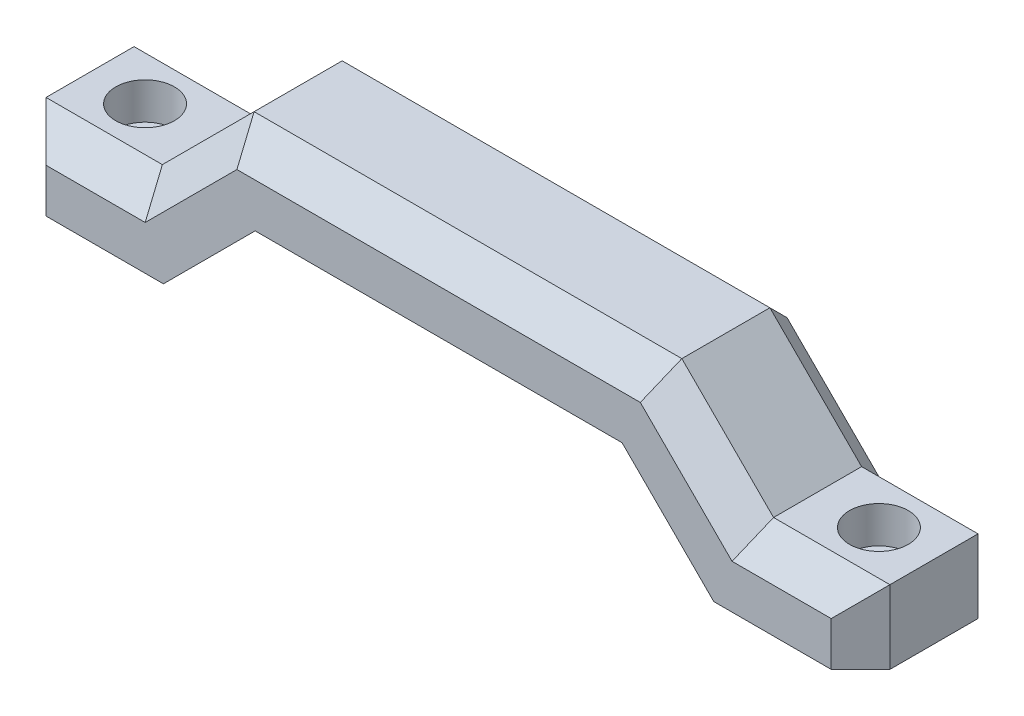
ISO-10303-21;
HEADER;
FILE_DESCRIPTION(('STEP AP214'),'2;1');
FILE_NAME('part.step','',(''),(''),'','','');
FILE_SCHEMA(('AUTOMOTIVE_DESIGN { 1 0 10303 214 1 1 1 1 }'));
ENDSEC;
DATA;
#1=APPLICATION_CONTEXT('core data for automotive mechanical design processes');
#2=APPLICATION_PROTOCOL_DEFINITION('international standard','automotive_design',2000,#1);
#3=PRODUCT_CONTEXT('',#1,'mechanical');
#4=PRODUCT('Part','Part','',(#3));
#5=PRODUCT_RELATED_PRODUCT_CATEGORY('part','',(#4));
#6=PRODUCT_DEFINITION_FORMATION('','',#4);
#7=PRODUCT_DEFINITION_CONTEXT('part definition',#1,'design');
#8=PRODUCT_DEFINITION('design','',#6,#7);
#9=PRODUCT_DEFINITION_SHAPE('','',#8);
#10=(LENGTH_UNIT() NAMED_UNIT(*) SI_UNIT(.MILLI.,.METRE.));
#11=(NAMED_UNIT(*) PLANE_ANGLE_UNIT() SI_UNIT($,.RADIAN.));
#12=(NAMED_UNIT(*) SI_UNIT($,.STERADIAN.) SOLID_ANGLE_UNIT());
#13=UNCERTAINTY_MEASURE_WITH_UNIT(LENGTH_MEASURE(1.E-05),#10,'distance_accuracy_value','');
#14=(GEOMETRIC_REPRESENTATION_CONTEXT(3) GLOBAL_UNCERTAINTY_ASSIGNED_CONTEXT((#13)) GLOBAL_UNIT_ASSIGNED_CONTEXT((#10,
#11,#12)) REPRESENTATION_CONTEXT('',''));
#15=CARTESIAN_POINT('',(0.,0.,0.));
#16=DIRECTION('',(0.,0.,1.));
#17=DIRECTION('',(1.,0.,0.));
#18=AXIS2_PLACEMENT_3D('',#15,#16,#17);
#19=CARTESIAN_POINT('',(-50.,-12.5,10.));
#20=DIRECTION('',(0.,1.,0.));
#21=DIRECTION('',(-1.,0.,0.));
#22=AXIS2_PLACEMENT_3D('',#19,#20,#21);
#23=CYLINDRICAL_SURFACE('',#22,1.75);
#24=CARTESIAN_POINT('',(-50.,-12.5,10.));
#25=DIRECTION('',(0.,1.,0.));
#26=DIRECTION('',(-1.,0.,0.));
#27=AXIS2_PLACEMENT_3D('',#24,#25,#26);
#28=CIRCLE('',#27,1.75);
#29=CARTESIAN_POINT('',(-51.75,-12.5,10.));
#30=VERTEX_POINT('',#29);
#31=EDGE_CURVE('E292',#30,#30,#28,.T.);
#32=CARTESIAN_POINT('',(-50.,-7.49999999999997,10.));
#33=DIRECTION('',(0.,1.,0.));
#34=DIRECTION('',(-1.,0.,0.));
#35=AXIS2_PLACEMENT_3D('',#32,#33,#34);
#36=CIRCLE('',#35,1.75);
#37=CARTESIAN_POINT('',(-51.75,-7.49999999999997,10.));
#38=VERTEX_POINT('',#37);
#39=EDGE_CURVE('E44',#38,#38,#36,.F.);
#40=CARTESIAN_POINT('',(-51.75,-12.5,10.));
#41=CARTESIAN_POINT('',(-51.75,-12.4479166666667,10.));
#42=CARTESIAN_POINT('',(-51.75,-12.3958333333334,10.));
#43=CARTESIAN_POINT('',(-51.75,-12.2916666666667,10.));
#44=CARTESIAN_POINT('',(-51.75,-12.2395833333334,10.));
#45=CARTESIAN_POINT('',(-51.75,-12.1354166666667,10.));
#46=CARTESIAN_POINT('',(-51.75,-12.0833333333334,10.));
#47=CARTESIAN_POINT('',(-51.75,-11.9791666666667,10.));
#48=CARTESIAN_POINT('',(-51.75,-11.9270833333334,10.));
#49=CARTESIAN_POINT('',(-51.75,-11.8229166666667,10.));
#50=CARTESIAN_POINT('',(-51.75,-11.7708333333334,10.));
#51=CARTESIAN_POINT('',(-51.75,-11.6666666666667,10.));
#52=CARTESIAN_POINT('',(-51.75,-11.6145833333334,10.));
#53=CARTESIAN_POINT('',(-51.75,-11.5104166666667,10.));
#54=CARTESIAN_POINT('',(-51.75,-11.4583333333334,10.));
#55=CARTESIAN_POINT('',(-51.75,-11.3541666666667,10.));
#56=CARTESIAN_POINT('',(-51.75,-11.3020833333334,10.));
#57=CARTESIAN_POINT('',(-51.75,-11.1979166666667,10.));
#58=CARTESIAN_POINT('',(-51.75,-11.1458333333333,10.));
#59=CARTESIAN_POINT('',(-51.75,-11.0416666666667,10.));
#60=CARTESIAN_POINT('',(-51.75,-10.9895833333333,10.));
#61=CARTESIAN_POINT('',(-51.75,-10.8854166666667,10.));
#62=CARTESIAN_POINT('',(-51.75,-10.8333333333333,10.));
#63=CARTESIAN_POINT('',(-51.75,-10.7291666666667,10.));
#64=CARTESIAN_POINT('',(-51.75,-10.6770833333333,10.));
#65=CARTESIAN_POINT('',(-51.75,-10.5729166666667,10.));
#66=CARTESIAN_POINT('',(-51.75,-10.5208333333333,10.));
#67=CARTESIAN_POINT('',(-51.75,-10.4166666666667,10.));
#68=CARTESIAN_POINT('',(-51.75,-10.3645833333333,10.));
#69=CARTESIAN_POINT('',(-51.75,-10.2604166666667,10.));
#70=CARTESIAN_POINT('',(-51.75,-10.2083333333333,10.));
#71=CARTESIAN_POINT('',(-51.75,-10.1041666666667,10.));
#72=CARTESIAN_POINT('',(-51.75,-10.0520833333333,10.));
#73=CARTESIAN_POINT('',(-51.75,-9.94791666666666,10.));
#74=CARTESIAN_POINT('',(-51.75,-9.89583333333333,10.));
#75=CARTESIAN_POINT('',(-51.75,-9.79166666666666,10.));
#76=CARTESIAN_POINT('',(-51.75,-9.73958333333333,10.));
#77=CARTESIAN_POINT('',(-51.75,-9.63541666666666,10.));
#78=CARTESIAN_POINT('',(-51.75,-9.58333333333333,10.));
#79=CARTESIAN_POINT('',(-51.75,-9.47916666666666,10.));
#80=CARTESIAN_POINT('',(-51.75,-9.42708333333333,10.));
#81=CARTESIAN_POINT('',(-51.75,-9.32291666666666,10.));
#82=CARTESIAN_POINT('',(-51.75,-9.27083333333332,10.));
#83=CARTESIAN_POINT('',(-51.75,-9.16666666666666,10.));
#84=CARTESIAN_POINT('',(-51.75,-9.11458333333332,10.));
#85=CARTESIAN_POINT('',(-51.75,-9.01041666666665,10.));
#86=CARTESIAN_POINT('',(-51.75,-8.95833333333332,10.));
#87=CARTESIAN_POINT('',(-51.75,-8.85416666666665,10.));
#88=CARTESIAN_POINT('',(-51.75,-8.80208333333332,10.));
#89=CARTESIAN_POINT('',(-51.75,-8.69791666666665,10.));
#90=CARTESIAN_POINT('',(-51.75,-8.64583333333331,10.));
#91=CARTESIAN_POINT('',(-51.75,-8.54166666666665,10.));
#92=CARTESIAN_POINT('',(-51.75,-8.48958333333331,10.));
#93=CARTESIAN_POINT('',(-51.75,-8.38541666666664,10.));
#94=CARTESIAN_POINT('',(-51.75,-8.33333333333331,10.));
#95=CARTESIAN_POINT('',(-51.75,-8.22916666666664,10.));
#96=CARTESIAN_POINT('',(-51.75,-8.17708333333331,10.));
#97=CARTESIAN_POINT('',(-51.75,-8.07291666666664,10.));
#98=CARTESIAN_POINT('',(-51.75,-8.02083333333331,10.));
#99=CARTESIAN_POINT('',(-51.75,-7.91666666666664,10.));
#100=CARTESIAN_POINT('',(-51.75,-7.8645833333333,10.));
#101=CARTESIAN_POINT('',(-51.75,-7.76041666666664,10.));
#102=CARTESIAN_POINT('',(-51.75,-7.7083333333333,10.));
#103=CARTESIAN_POINT('',(-51.75,-7.60416666666663,10.));
#104=CARTESIAN_POINT('',(-51.75,-7.5520833333333,10.));
#105=CARTESIAN_POINT('',(-51.75,-7.49999999999997,10.));
#106=B_SPLINE_CURVE_WITH_KNOTS('',3,(#40,#41,#42,#43,#44,#45,#46,#47,#48,#49,#50,#51,#52,#53,
#54,#55,#56,#57,#58,#59,#60,#61,#62,#63,#64,#65,#66,#67,#68,#69,#70,#71,#72,#73,#74,#75,#76,#77,
#78,#79,#80,#81,#82,#83,#84,#85,#86,#87,#88,#89,#90,#91,#92,#93,#94,#95,#96,#97,#98,#99,#100,
#101,#102,#103,#104,#105),.UNSPECIFIED.,.F.,.F.,(4,2,2,2,2,2,2,2,2,2,2,2,2,2,2,2,2,2,2,2,2,2,2,
2,2,2,2,2,2,2,2,2,4),(0.,0.156250000000002,0.312500000000004,0.468750000000006,
0.625000000000008,0.781250000000009,0.937500000000011,1.09375000000001,1.25000000000002,
1.40625000000002,1.56250000000002,1.71875000000002,1.87500000000002,2.03125000000003,
2.18750000000003,2.34375000000003,2.50000000000003,2.65625000000004,2.81250000000004,
2.96875000000004,3.12500000000004,3.28125000000004,3.43750000000004,3.59375000000005,
3.75000000000005,3.90625000000005,4.06250000000005,4.21875000000006,4.37500000000006,
4.53125000000006,4.68750000000006,4.84375000000006,5.00000000000007),.UNSPECIFIED.);
#107=EDGE_CURVE('BSEAM39',#30,#38,#106,.T.);
#108=ORIENTED_EDGE('',*,*,#31,.F.);
#109=ORIENTED_EDGE('',*,*,#39,.F.);
#110=ORIENTED_EDGE('',*,*,#107,.T.);
#111=ORIENTED_EDGE('',*,*,#107,.F.);
#112=EDGE_LOOP('',(#108,#110,#109,#111));
#113=FACE_BOUND('',#112,.T.);
#114=ADVANCED_FACE('F39',(#113),#23,.F.);
#115=CARTESIAN_POINT('',(50.,-12.5,10.));
#116=DIRECTION('',(0.,1.,0.));
#117=DIRECTION('',(-1.,0.,0.));
#118=AXIS2_PLACEMENT_3D('',#115,#116,#117);
#119=CYLINDRICAL_SURFACE('',#118,1.75);
#120=CARTESIAN_POINT('',(50.,-12.5,10.));
#121=DIRECTION('',(0.,1.,0.));
#122=DIRECTION('',(-1.,0.,0.));
#123=AXIS2_PLACEMENT_3D('',#120,#121,#122);
#124=CIRCLE('',#123,1.75);
#125=CARTESIAN_POINT('',(48.25,-12.5,10.));
#126=VERTEX_POINT('',#125);
#127=EDGE_CURVE('E311',#126,#126,#124,.T.);
#128=CARTESIAN_POINT('',(50.,-7.49999999999994,10.));
#129=DIRECTION('',(0.,1.,0.));
#130=DIRECTION('',(-1.,0.,0.));
#131=AXIS2_PLACEMENT_3D('',#128,#129,#130);
#132=CIRCLE('',#131,1.75);
#133=CARTESIAN_POINT('',(48.25,-7.49999999999994,10.));
#134=VERTEX_POINT('',#133);
#135=EDGE_CURVE('E305',#134,#134,#132,.F.);
#136=CARTESIAN_POINT('',(48.25,-12.5,10.));
#137=CARTESIAN_POINT('',(48.25,-12.4479166666666,10.));
#138=CARTESIAN_POINT('',(48.25,-12.3958333333333,10.));
#139=CARTESIAN_POINT('',(48.25,-12.2916666666666,10.));
#140=CARTESIAN_POINT('',(48.25,-12.2395833333333,10.));
#141=CARTESIAN_POINT('',(48.25,-12.1354166666666,10.));
#142=CARTESIAN_POINT('',(48.25,-12.0833333333333,10.));
#143=CARTESIAN_POINT('',(48.25,-11.9791666666666,10.));
#144=CARTESIAN_POINT('',(48.25,-11.9270833333333,10.));
#145=CARTESIAN_POINT('',(48.25,-11.8229166666666,10.));
#146=CARTESIAN_POINT('',(48.25,-11.7708333333333,10.));
#147=CARTESIAN_POINT('',(48.25,-11.6666666666666,10.));
#148=CARTESIAN_POINT('',(48.25,-11.6145833333333,10.));
#149=CARTESIAN_POINT('',(48.25,-11.5104166666666,10.));
#150=CARTESIAN_POINT('',(48.25,-11.4583333333333,10.));
#151=CARTESIAN_POINT('',(48.25,-11.3541666666666,10.));
#152=CARTESIAN_POINT('',(48.25,-11.3020833333333,10.));
#153=CARTESIAN_POINT('',(48.25,-11.1979166666666,10.));
#154=CARTESIAN_POINT('',(48.25,-11.1458333333333,10.));
#155=CARTESIAN_POINT('',(48.25,-11.0416666666666,10.));
#156=CARTESIAN_POINT('',(48.25,-10.9895833333333,10.));
#157=CARTESIAN_POINT('',(48.25,-10.8854166666666,10.));
#158=CARTESIAN_POINT('',(48.25,-10.8333333333333,10.));
#159=CARTESIAN_POINT('',(48.25,-10.7291666666666,10.));
#160=CARTESIAN_POINT('',(48.25,-10.6770833333333,10.));
#161=CARTESIAN_POINT('',(48.25,-10.5729166666666,10.));
#162=CARTESIAN_POINT('',(48.25,-10.5208333333333,10.));
#163=CARTESIAN_POINT('',(48.25,-10.4166666666666,10.));
#164=CARTESIAN_POINT('',(48.25,-10.3645833333333,10.));
#165=CARTESIAN_POINT('',(48.25,-10.2604166666666,10.));
#166=CARTESIAN_POINT('',(48.25,-10.2083333333333,10.));
#167=CARTESIAN_POINT('',(48.25,-10.1041666666666,10.));
#168=CARTESIAN_POINT('',(48.25,-10.0520833333333,10.));
#169=CARTESIAN_POINT('',(48.25,-9.94791666666663,10.));
#170=CARTESIAN_POINT('',(48.25,-9.89583333333329,10.));
#171=CARTESIAN_POINT('',(48.25,-9.79166666666663,10.));
#172=CARTESIAN_POINT('',(48.25,-9.73958333333329,10.));
#173=CARTESIAN_POINT('',(48.25,-9.63541666666662,10.));
#174=CARTESIAN_POINT('',(48.25,-9.58333333333329,10.));
#175=CARTESIAN_POINT('',(48.25,-9.47916666666662,10.));
#176=CARTESIAN_POINT('',(48.25,-9.42708333333329,10.));
#177=CARTESIAN_POINT('',(48.25,-9.32291666666662,10.));
#178=CARTESIAN_POINT('',(48.25,-9.27083333333329,10.));
#179=CARTESIAN_POINT('',(48.25,-9.16666666666662,10.));
#180=CARTESIAN_POINT('',(48.25,-9.11458333333329,10.));
#181=CARTESIAN_POINT('',(48.25,-9.01041666666662,10.));
#182=CARTESIAN_POINT('',(48.25,-8.95833333333329,10.));
#183=CARTESIAN_POINT('',(48.25,-8.85416666666662,10.));
#184=CARTESIAN_POINT('',(48.25,-8.80208333333328,10.));
#185=CARTESIAN_POINT('',(48.25,-8.69791666666662,10.));
#186=CARTESIAN_POINT('',(48.25,-8.64583333333328,10.));
#187=CARTESIAN_POINT('',(48.25,-8.54166666666662,10.));
#188=CARTESIAN_POINT('',(48.25,-8.48958333333328,10.));
#189=CARTESIAN_POINT('',(48.25,-8.38541666666662,10.));
#190=CARTESIAN_POINT('',(48.25,-8.33333333333328,10.));
#191=CARTESIAN_POINT('',(48.25,-8.22916666666662,10.));
#192=CARTESIAN_POINT('',(48.25,-8.17708333333328,10.));
#193=CARTESIAN_POINT('',(48.25,-8.07291666666661,10.));
#194=CARTESIAN_POINT('',(48.25,-8.02083333333328,10.));
#195=CARTESIAN_POINT('',(48.25,-7.91666666666661,10.));
#196=CARTESIAN_POINT('',(48.25,-7.86458333333328,10.));
#197=CARTESIAN_POINT('',(48.25,-7.76041666666661,10.));
#198=CARTESIAN_POINT('',(48.25,-7.70833333333328,10.));
#199=CARTESIAN_POINT('',(48.25,-7.60416666666661,10.));
#200=CARTESIAN_POINT('',(48.25,-7.55208333333328,10.));
#201=CARTESIAN_POINT('',(48.25,-7.49999999999994,10.));
#202=B_SPLINE_CURVE_WITH_KNOTS('',3,(#136,#137,#138,#139,#140,#141,#142,#143,#144,#145,#146,
#147,#148,#149,#150,#151,#152,#153,#154,#155,#156,#157,#158,#159,#160,#161,#162,#163,#164,#165,
#166,#167,#168,#169,#170,#171,#172,#173,#174,#175,#176,#177,#178,#179,#180,#181,#182,#183,#184,
#185,#186,#187,#188,#189,#190,#191,#192,#193,#194,#195,#196,#197,#198,#199,#200,#201),
.UNSPECIFIED.,.F.,.F.,(4,2,2,2,2,2,2,2,2,2,2,2,2,2,2,2,2,2,2,2,2,2,2,2,2,2,2,2,2,2,2,2,4),(0.,
0.15625,0.312500000000002,0.468750000000002,0.625000000000004,0.781250000000004,
0.937500000000006,1.09375000000001,1.25000000000001,1.40625000000001,1.56250000000001,
1.71875000000001,1.87500000000001,2.03125000000001,2.18750000000001,2.34375000000002,
2.50000000000002,2.65625000000002,2.81250000000002,2.96875000000002,3.12500000000002,
3.28125000000002,3.43750000000002,3.59375000000002,3.75000000000002,3.90625000000002,
4.06250000000003,4.21875000000003,4.37500000000003,4.53125000000003,4.68750000000003,
4.84375000000003,5.00000000000003),.UNSPECIFIED.);
#203=EDGE_CURVE('BSEAM422',#126,#134,#202,.T.);
#204=ORIENTED_EDGE('',*,*,#127,.F.);
#205=ORIENTED_EDGE('',*,*,#135,.F.);
#206=ORIENTED_EDGE('',*,*,#203,.T.);
#207=ORIENTED_EDGE('',*,*,#203,.F.);
#208=EDGE_LOOP('',(#204,#206,#205,#207));
#209=FACE_BOUND('',#208,.T.);
#210=ADVANCED_FACE('F422',(#209),#119,.F.);
#211=CARTESIAN_POINT('',(-25.,0.,20.));
#212=DIRECTION('',(-0.707106781186544,0.707106781186551,0.));
#213=DIRECTION('',(-0.707106781186551,-0.707106781186544,0.));
#214=AXIS2_PLACEMENT_3D('',#211,#212,#213);
#215=PLANE('',#214);
#216=DIRECTION('',(0.707106781186551,0.707106781186544,0.));
#217=VECTOR('',#216,1.);
#218=CARTESIAN_POINT('',(-25.,0.,0.));
#219=LINE('',#218,#217);
#220=CARTESIAN_POINT('',(-37.5000000000001,-12.5,0.));
#221=VERTEX_POINT('',#220);
#222=CARTESIAN_POINT('',(-25.,0.,0.));
#223=VERTEX_POINT('',#222);
#224=EDGE_CURVE('E204',#221,#223,#219,.T.);
#225=ORIENTED_EDGE('',*,*,#224,.T.);
#226=DIRECTION('',(0.,0.,-1.));
#227=VECTOR('',#226,1.);
#228=CARTESIAN_POINT('',(-25.,0.,20.));
#229=LINE('',#228,#227);
#230=CARTESIAN_POINT('',(-25.,0.,20.));
#231=VERTEX_POINT('',#230);
#232=EDGE_CURVE('E184',#231,#223,#229,.T.);
#233=ORIENTED_EDGE('',*,*,#232,.F.);
#234=DIRECTION('',(0.707106781186551,0.707106781186544,0.));
#235=VECTOR('',#234,1.);
#236=CARTESIAN_POINT('',(-25.,0.,20.));
#237=LINE('',#236,#235);
#238=CARTESIAN_POINT('',(-37.5000000000001,-12.5,20.));
#239=VERTEX_POINT('',#238);
#240=EDGE_CURVE('E190',#239,#231,#237,.T.);
#241=ORIENTED_EDGE('',*,*,#240,.F.);
#242=DIRECTION('',(0.,0.,-1.));
#243=VECTOR('',#242,1.);
#244=CARTESIAN_POINT('',(-37.5000000000001,-12.5,20.));
#245=LINE('',#244,#243);
#246=EDGE_CURVE('E334',#239,#221,#245,.T.);
#247=ORIENTED_EDGE('',*,*,#246,.T.);
#248=EDGE_LOOP('',(#225,#233,#241,#247));
#249=FACE_BOUND('',#248,.T.);
#250=ADVANCED_FACE('F202',(#249),#215,.F.);
#251=CARTESIAN_POINT('',(-25.,0.,20.));
#252=DIRECTION('',(0.,1.,0.));
#253=DIRECTION('',(0.,0.,1.));
#254=AXIS2_PLACEMENT_3D('',#251,#252,#253);
#255=PLANE('',#254);
#256=DIRECTION('',(1.,0.,0.));
#257=VECTOR('',#256,1.);
#258=CARTESIAN_POINT('',(-25.,0.,0.));
#259=LINE('',#258,#257);
#260=CARTESIAN_POINT('',(25.,0.,0.));
#261=VERTEX_POINT('',#260);
#262=EDGE_CURVE('E336',#223,#261,#259,.T.);
#263=ORIENTED_EDGE('',*,*,#262,.T.);
#264=DIRECTION('',(0.,0.,-1.));
#265=VECTOR('',#264,1.);
#266=CARTESIAN_POINT('',(25.,0.,20.));
#267=LINE('',#266,#265);
#268=CARTESIAN_POINT('',(25.,0.,20.));
#269=VERTEX_POINT('',#268);
#270=EDGE_CURVE('E187',#269,#261,#267,.T.);
#271=ORIENTED_EDGE('',*,*,#270,.F.);
#272=DIRECTION('',(1.,0.,0.));
#273=VECTOR('',#272,1.);
#274=CARTESIAN_POINT('',(-25.,0.,20.));
#275=LINE('',#274,#273);
#276=EDGE_CURVE('E180',#231,#269,#275,.T.);
#277=ORIENTED_EDGE('',*,*,#276,.F.);
#278=ORIENTED_EDGE('',*,*,#232,.T.);
#279=EDGE_LOOP('',(#263,#271,#277,#278));
#280=FACE_BOUND('',#279,.T.);
#281=ADVANCED_FACE('F182',(#280),#255,.F.);
#282=CARTESIAN_POINT('',(25.,0.,20.));
#283=DIRECTION('',(0.707106781186549,0.707106781186547,0.));
#284=DIRECTION('',(-0.707106781186546,0.707106781186549,0.));
#285=AXIS2_PLACEMENT_3D('',#282,#283,#284);
#286=PLANE('',#285);
#287=DIRECTION('',(0.707106781186547,-0.707106781186549,0.));
#288=VECTOR('',#287,1.);
#289=CARTESIAN_POINT('',(25.,0.,0.));
#290=LINE('',#289,#288);
#291=CARTESIAN_POINT('',(37.4999999999999,-12.5,0.));
#292=VERTEX_POINT('',#291);
#293=EDGE_CURVE('E338',#261,#292,#290,.T.);
#294=ORIENTED_EDGE('',*,*,#293,.T.);
#295=DIRECTION('',(0.,0.,-1.));
#296=VECTOR('',#295,1.);
#297=CARTESIAN_POINT('',(37.4999999999999,-12.5,20.));
#298=LINE('',#297,#296);
#299=CARTESIAN_POINT('',(37.4999999999999,-12.5,20.));
#300=VERTEX_POINT('',#299);
#301=EDGE_CURVE('E209',#300,#292,#298,.T.);
#302=ORIENTED_EDGE('',*,*,#301,.F.);
#303=DIRECTION('',(0.707106781186547,-0.707106781186549,0.));
#304=VECTOR('',#303,1.);
#305=CARTESIAN_POINT('',(25.,0.,20.));
#306=LINE('',#305,#304);
#307=EDGE_CURVE('E189',#269,#300,#306,.T.);
#308=ORIENTED_EDGE('',*,*,#307,.F.);
#309=ORIENTED_EDGE('',*,*,#270,.T.);
#310=EDGE_LOOP('',(#294,#302,#308,#309));
#311=FACE_BOUND('',#310,.T.);
#312=ADVANCED_FACE('F411',(#311),#286,.F.);
#313=CARTESIAN_POINT('',(37.4999999999999,-12.5,20.));
#314=DIRECTION('',(0.,1.,0.));
#315=DIRECTION('',(-1.,0.,0.));
#316=AXIS2_PLACEMENT_3D('',#313,#314,#315);
#317=PLANE('',#316);
#318=ORIENTED_EDGE('',*,*,#127,.T.);
#319=EDGE_LOOP('',(#318));
#320=FACE_BOUND('',#319,.T.);
#321=DIRECTION('',(1.,0.,0.));
#322=VECTOR('',#321,1.);
#323=CARTESIAN_POINT('',(37.4999999999999,-12.5,0.));
#324=LINE('',#323,#322);
#325=CARTESIAN_POINT('',(53.4999999999999,-12.4999999999999,0.));
#326=VERTEX_POINT('',#325);
#327=EDGE_CURVE('E340',#292,#326,#324,.T.);
#328=ORIENTED_EDGE('',*,*,#327,.T.);
#329=DIRECTION('',(-0.707106781186549,0.,-0.707106781186546));
#330=VECTOR('',#329,1.);
#331=CARTESIAN_POINT('',(57.4999999999999,-12.4999999999999,4.));
#332=LINE('',#331,#330);
#333=CARTESIAN_POINT('',(57.4999999999999,-12.4999999999999,4.));
#334=VERTEX_POINT('',#333);
#335=EDGE_CURVE('E239',#326,#334,#332,.F.);
#336=ORIENTED_EDGE('',*,*,#335,.T.);
#337=DIRECTION('',(0.,0.,-1.));
#338=VECTOR('',#337,1.);
#339=CARTESIAN_POINT('',(57.4999999999999,-12.4999999999999,20.));
#340=LINE('',#339,#338);
#341=CARTESIAN_POINT('',(57.4999999999999,-12.4999999999999,16.));
#342=VERTEX_POINT('',#341);
#343=EDGE_CURVE('E366',#342,#334,#340,.T.);
#344=ORIENTED_EDGE('',*,*,#343,.F.);
#345=DIRECTION('',(-0.707106781186546,0.,0.707106781186549));
#346=VECTOR('',#345,1.);
#347=CARTESIAN_POINT('',(53.4999999999999,-12.4999999999999,20.));
#348=LINE('',#347,#346);
#349=CARTESIAN_POINT('',(53.4999999999999,-12.4999999999999,20.));
#350=VERTEX_POINT('',#349);
#351=EDGE_CURVE('E237',#342,#350,#348,.T.);
#352=ORIENTED_EDGE('',*,*,#351,.T.);
#353=DIRECTION('',(1.,0.,0.));
#354=VECTOR('',#353,1.);
#355=CARTESIAN_POINT('',(37.4999999999999,-12.5,20.));
#356=LINE('',#355,#354);
#357=EDGE_CURVE('E331',#300,#350,#356,.T.);
#358=ORIENTED_EDGE('',*,*,#357,.F.);
#359=ORIENTED_EDGE('',*,*,#301,.T.);
#360=EDGE_LOOP('',(#328,#336,#344,#352,#358,#359));
#361=FACE_BOUND('',#360,.T.);
#362=ADVANCED_FACE('F373',(#320,#361),#317,.F.);
#363=CARTESIAN_POINT('',(57.4999999999999,-2.49999999999995,20.));
#364=DIRECTION('',(-1.,0.,0.));
#365=DIRECTION('',(0.,0.,1.));
#366=AXIS2_PLACEMENT_3D('',#363,#364,#365);
#367=PLANE('',#366);
#368=ORIENTED_EDGE('',*,*,#343,.T.);
#369=DIRECTION('',(0.,1.,0.));
#370=VECTOR('',#369,1.);
#371=CARTESIAN_POINT('',(57.4999999999999,-2.49999999999995,4.));
#372=LINE('',#371,#370);
#373=CARTESIAN_POINT('',(57.4999999999999,-2.49999999999995,4.));
#374=VERTEX_POINT('',#373);
#375=EDGE_CURVE('E235',#334,#374,#372,.T.);
#376=ORIENTED_EDGE('',*,*,#375,.T.);
#377=DIRECTION('',(0.,0.,-1.));
#378=VECTOR('',#377,1.);
#379=CARTESIAN_POINT('',(57.4999999999999,-2.49999999999995,20.));
#380=LINE('',#379,#378);
#381=CARTESIAN_POINT('',(57.4999999999999,-2.49999999999995,16.));
#382=VERTEX_POINT('',#381);
#383=EDGE_CURVE('E363',#382,#374,#380,.T.);
#384=ORIENTED_EDGE('',*,*,#383,.F.);
#385=DIRECTION('',(0.,-1.,0.));
#386=VECTOR('',#385,1.);
#387=CARTESIAN_POINT('',(57.4999999999999,-12.4999999999999,16.));
#388=LINE('',#387,#386);
#389=EDGE_CURVE('E233',#382,#342,#388,.T.);
#390=ORIENTED_EDGE('',*,*,#389,.T.);
#391=EDGE_LOOP('',(#368,#376,#384,#390));
#392=FACE_BOUND('',#391,.T.);
#393=ADVANCED_FACE('F407',(#392),#367,.F.);
#394=CARTESIAN_POINT('',(41.6421356237309,-2.49999999999995,20.));
#395=DIRECTION('',(0.,-1.,0.));
#396=DIRECTION('',(1.,0.,0.));
#397=AXIS2_PLACEMENT_3D('',#394,#395,#396);
#398=PLANE('',#397);
#399=CARTESIAN_POINT('',(50.,-2.49999999999994,10.));
#400=DIRECTION('',(0.,1.,0.));
#401=DIRECTION('',(-1.,0.,0.));
#402=AXIS2_PLACEMENT_3D('',#399,#400,#401);
#403=CIRCLE('',#402,4.00000000000001);
#404=CARTESIAN_POINT('',(46.,-2.49999999999994,10.));
#405=VERTEX_POINT('',#404);
#406=EDGE_CURVE('E318',#405,#405,#403,.T.);
#407=ORIENTED_EDGE('',*,*,#406,.F.);
#408=EDGE_LOOP('',(#407));
#409=FACE_BOUND('',#408,.T.);
#410=ORIENTED_EDGE('',*,*,#383,.T.);
#411=DIRECTION('',(-1.,0.,0.));
#412=VECTOR('',#411,1.);
#413=CARTESIAN_POINT('',(41.6421356237309,-2.49999999999995,4.));
#414=LINE('',#413,#412);
#415=CARTESIAN_POINT('',(41.6421356237309,-2.49999999999995,4.));
#416=VERTEX_POINT('',#415);
#417=EDGE_CURVE('E259',#374,#416,#414,.T.);
#418=ORIENTED_EDGE('',*,*,#417,.T.);
#419=DIRECTION('',(0.,0.,-1.));
#420=VECTOR('',#419,1.);
#421=CARTESIAN_POINT('',(41.6421356237309,-2.49999999999995,20.));
#422=LINE('',#421,#420);
#423=CARTESIAN_POINT('',(41.6421356237309,-2.49999999999995,16.));
#424=VERTEX_POINT('',#423);
#425=EDGE_CURVE('E360',#424,#416,#422,.T.);
#426=ORIENTED_EDGE('',*,*,#425,.F.);
#427=DIRECTION('',(1.,0.,0.));
#428=VECTOR('',#427,1.);
#429=CARTESIAN_POINT('',(57.4999999999999,-2.49999999999995,16.));
#430=LINE('',#429,#428);
#431=EDGE_CURVE('E257',#424,#382,#430,.T.);
#432=ORIENTED_EDGE('',*,*,#431,.T.);
#433=EDGE_LOOP('',(#410,#418,#426,#432));
#434=FACE_BOUND('',#433,.T.);
#435=ADVANCED_FACE('F393',(#409,#434),#398,.F.);
#436=CARTESIAN_POINT('',(29.142135623731,10.,20.));
#437=DIRECTION('',(-0.707106781186548,-0.707106781186547,0.));
#438=DIRECTION('',(0.707106781186547,-0.707106781186548,0.));
#439=AXIS2_PLACEMENT_3D('',#436,#437,#438);
#440=PLANE('',#439);
#441=ORIENTED_EDGE('',*,*,#425,.T.);
#442=DIRECTION('',(-0.707106781186547,0.707106781186548,0.));
#443=VECTOR('',#442,1.);
#444=CARTESIAN_POINT('',(29.142135623731,10.,4.));
#445=LINE('',#444,#443);
#446=CARTESIAN_POINT('',(29.142135623731,10.,4.));
#447=VERTEX_POINT('',#446);
#448=EDGE_CURVE('E255',#416,#447,#445,.T.);
#449=ORIENTED_EDGE('',*,*,#448,.T.);
#450=DIRECTION('',(0.,0.,-1.));
#451=VECTOR('',#450,1.);
#452=CARTESIAN_POINT('',(29.142135623731,10.,20.));
#453=LINE('',#452,#451);
#454=CARTESIAN_POINT('',(29.142135623731,10.,16.));
#455=VERTEX_POINT('',#454);
#456=EDGE_CURVE('E357',#455,#447,#453,.T.);
#457=ORIENTED_EDGE('',*,*,#456,.F.);
#458=DIRECTION('',(0.707106781186547,-0.707106781186548,0.));
#459=VECTOR('',#458,1.);
#460=CARTESIAN_POINT('',(41.6421356237309,-2.49999999999995,16.));
#461=LINE('',#460,#459);
#462=EDGE_CURVE('E253',#455,#424,#461,.T.);
#463=ORIENTED_EDGE('',*,*,#462,.T.);
#464=EDGE_LOOP('',(#441,#449,#457,#463));
#465=FACE_BOUND('',#464,.T.);
#466=ADVANCED_FACE('F397',(#465),#440,.F.);
#467=CARTESIAN_POINT('',(-29.1421356237309,10.,20.));
#468=DIRECTION('',(0.,-1.,0.));
#469=DIRECTION('',(0.,0.,-1.));
#470=AXIS2_PLACEMENT_3D('',#467,#468,#469);
#471=PLANE('',#470);
#472=ORIENTED_EDGE('',*,*,#456,.T.);
#473=DIRECTION('',(-1.,0.,0.));
#474=VECTOR('',#473,1.);
#475=CARTESIAN_POINT('',(-29.1421356237309,10.,4.));
#476=LINE('',#475,#474);
#477=CARTESIAN_POINT('',(-29.1421356237309,10.,4.));
#478=VERTEX_POINT('',#477);
#479=EDGE_CURVE('E251',#447,#478,#476,.T.);
#480=ORIENTED_EDGE('',*,*,#479,.T.);
#481=DIRECTION('',(0.,0.,-1.));
#482=VECTOR('',#481,1.);
#483=CARTESIAN_POINT('',(-29.1421356237309,10.,20.));
#484=LINE('',#483,#482);
#485=CARTESIAN_POINT('',(-29.1421356237309,10.,16.));
#486=VERTEX_POINT('',#485);
#487=EDGE_CURVE('E354',#486,#478,#484,.T.);
#488=ORIENTED_EDGE('',*,*,#487,.F.);
#489=DIRECTION('',(1.,0.,0.));
#490=VECTOR('',#489,1.);
#491=CARTESIAN_POINT('',(29.142135623731,10.,16.));
#492=LINE('',#491,#490);
#493=EDGE_CURVE('E249',#486,#455,#492,.T.);
#494=ORIENTED_EDGE('',*,*,#493,.T.);
#495=EDGE_LOOP('',(#472,#480,#488,#494));
#496=FACE_BOUND('',#495,.T.);
#497=ADVANCED_FACE('F455',(#496),#471,.F.);
#498=CARTESIAN_POINT('',(-29.1421356237309,10.,20.));
#499=DIRECTION('',(0.707106781186544,-0.707106781186551,0.));
#500=DIRECTION('',(0.707106781186551,0.707106781186544,0.));
#501=AXIS2_PLACEMENT_3D('',#498,#499,#500);
#502=PLANE('',#501);
#503=ORIENTED_EDGE('',*,*,#487,.T.);
#504=DIRECTION('',(-0.707106781186551,-0.707106781186544,0.));
#505=VECTOR('',#504,1.);
#506=CARTESIAN_POINT('',(-29.1421356237309,10.,4.00000000000001));
#507=LINE('',#506,#505);
#508=CARTESIAN_POINT('',(-41.642135623731,-2.49999999999997,4.00000000000001));
#509=VERTEX_POINT('',#508);
#510=EDGE_CURVE('E247',#478,#509,#507,.T.);
#511=ORIENTED_EDGE('',*,*,#510,.T.);
#512=DIRECTION('',(0.,0.,-1.));
#513=VECTOR('',#512,1.);
#514=CARTESIAN_POINT('',(-41.642135623731,-2.49999999999997,20.));
#515=LINE('',#514,#513);
#516=CARTESIAN_POINT('',(-41.642135623731,-2.49999999999997,16.));
#517=VERTEX_POINT('',#516);
#518=EDGE_CURVE('E351',#517,#509,#515,.T.);
#519=ORIENTED_EDGE('',*,*,#518,.F.);
#520=DIRECTION('',(0.707106781186551,0.707106781186544,0.));
#521=VECTOR('',#520,1.);
#522=CARTESIAN_POINT('',(-29.1421356237309,10.,16.));
#523=LINE('',#522,#521);
#524=EDGE_CURVE('E245',#517,#486,#523,.T.);
#525=ORIENTED_EDGE('',*,*,#524,.T.);
#526=EDGE_LOOP('',(#503,#511,#519,#525));
#527=FACE_BOUND('',#526,.T.);
#528=ADVANCED_FACE('F451',(#527),#502,.F.);
#529=CARTESIAN_POINT('',(-41.642135623731,-2.49999999999997,20.));
#530=DIRECTION('',(0.,-1.,0.));
#531=DIRECTION('',(1.,0.,0.));
#532=AXIS2_PLACEMENT_3D('',#529,#530,#531);
#533=PLANE('',#532);
#534=CARTESIAN_POINT('',(-50.,-2.49999999999996,10.));
#535=DIRECTION('',(0.,1.,0.));
#536=DIRECTION('',(-1.,0.,0.));
#537=AXIS2_PLACEMENT_3D('',#534,#535,#536);
#538=CIRCLE('',#537,4.00000000000001);
#539=CARTESIAN_POINT('',(-54.,-2.49999999999997,10.));
#540=VERTEX_POINT('',#539);
#541=EDGE_CURVE('E313',#540,#540,#538,.T.);
#542=ORIENTED_EDGE('',*,*,#541,.F.);
#543=EDGE_LOOP('',(#542));
#544=FACE_BOUND('',#543,.T.);
#545=ORIENTED_EDGE('',*,*,#518,.T.);
#546=DIRECTION('',(-1.,0.,0.));
#547=VECTOR('',#546,1.);
#548=CARTESIAN_POINT('',(-41.642135623731,-2.49999999999997,4.));
#549=LINE('',#548,#547);
#550=CARTESIAN_POINT('',(-57.5000000000001,-2.49999999999997,4.));
#551=VERTEX_POINT('',#550);
#552=EDGE_CURVE('E243',#509,#551,#549,.T.);
#553=ORIENTED_EDGE('',*,*,#552,.T.);
#554=DIRECTION('',(0.,0.,-1.));
#555=VECTOR('',#554,1.);
#556=CARTESIAN_POINT('',(-57.5000000000001,-2.49999999999997,20.));
#557=LINE('',#556,#555);
#558=CARTESIAN_POINT('',(-57.5000000000001,-2.49999999999997,16.));
#559=VERTEX_POINT('',#558);
#560=EDGE_CURVE('E348',#559,#551,#557,.T.);
#561=ORIENTED_EDGE('',*,*,#560,.F.);
#562=DIRECTION('',(1.,0.,0.));
#563=VECTOR('',#562,1.);
#564=CARTESIAN_POINT('',(-41.642135623731,-2.49999999999997,16.));
#565=LINE('',#564,#563);
#566=EDGE_CURVE('E241',#559,#517,#565,.T.);
#567=ORIENTED_EDGE('',*,*,#566,.T.);
#568=EDGE_LOOP('',(#545,#553,#561,#567));
#569=FACE_BOUND('',#568,.T.);
#570=ADVANCED_FACE('F447',(#544,#569),#533,.F.);
#571=CARTESIAN_POINT('',(-57.5000000000001,-2.49999999999997,20.));
#572=DIRECTION('',(1.,0.,0.));
#573=DIRECTION('',(0.,0.,-1.));
#574=AXIS2_PLACEMENT_3D('',#571,#572,#573);
#575=PLANE('',#574);
#576=ORIENTED_EDGE('',*,*,#560,.T.);
#577=DIRECTION('',(0.,-1.,0.));
#578=VECTOR('',#577,1.);
#579=CARTESIAN_POINT('',(-57.5000000000001,-2.49999999999997,4.));
#580=LINE('',#579,#578);
#581=CARTESIAN_POINT('',(-57.5000000000001,-12.5,4.));
#582=VERTEX_POINT('',#581);
#583=EDGE_CURVE('E207',#551,#582,#580,.T.);
#584=ORIENTED_EDGE('',*,*,#583,.T.);
#585=DIRECTION('',(0.,0.,-1.));
#586=VECTOR('',#585,1.);
#587=CARTESIAN_POINT('',(-57.5000000000001,-12.5,20.));
#588=LINE('',#587,#586);
#589=CARTESIAN_POINT('',(-57.5000000000001,-12.5,16.));
#590=VERTEX_POINT('',#589);
#591=EDGE_CURVE('E345',#590,#582,#588,.T.);
#592=ORIENTED_EDGE('',*,*,#591,.F.);
#593=DIRECTION('',(0.,1.,0.));
#594=VECTOR('',#593,1.);
#595=CARTESIAN_POINT('',(-57.5000000000001,-2.49999999999997,16.));
#596=LINE('',#595,#594);
#597=EDGE_CURVE('E205',#590,#559,#596,.T.);
#598=ORIENTED_EDGE('',*,*,#597,.T.);
#599=EDGE_LOOP('',(#576,#584,#592,#598));
#600=FACE_BOUND('',#599,.T.);
#601=ADVANCED_FACE('F443',(#600),#575,.F.);
#602=CARTESIAN_POINT('',(-37.5000000000001,-12.5,20.));
#603=DIRECTION('',(0.,1.,0.));
#604=DIRECTION('',(-1.,0.,0.));
#605=AXIS2_PLACEMENT_3D('',#602,#603,#604);
#606=PLANE('',#605);
#607=ORIENTED_EDGE('',*,*,#31,.T.);
#608=EDGE_LOOP('',(#607));
#609=FACE_BOUND('',#608,.T.);
#610=ORIENTED_EDGE('',*,*,#591,.T.);
#611=DIRECTION('',(-0.707106781186549,0.,0.707106781186546));
#612=VECTOR('',#611,1.);
#613=CARTESIAN_POINT('',(-57.5000000000001,-12.5,4.));
#614=LINE('',#613,#612);
#615=CARTESIAN_POINT('',(-53.5000000000001,-12.5,0.));
#616=VERTEX_POINT('',#615);
#617=EDGE_CURVE('E217',#582,#616,#614,.F.);
#618=ORIENTED_EDGE('',*,*,#617,.T.);
#619=DIRECTION('',(1.,0.,0.));
#620=VECTOR('',#619,1.);
#621=CARTESIAN_POINT('',(-37.5000000000001,-12.5,0.));
#622=LINE('',#621,#620);
#623=EDGE_CURVE('E200',#616,#221,#622,.T.);
#624=ORIENTED_EDGE('',*,*,#623,.T.);
#625=ORIENTED_EDGE('',*,*,#246,.F.);
#626=DIRECTION('',(1.,0.,0.));
#627=VECTOR('',#626,1.);
#628=CARTESIAN_POINT('',(-37.5000000000001,-12.5,20.));
#629=LINE('',#628,#627);
#630=CARTESIAN_POINT('',(-53.5000000000001,-12.5,20.));
#631=VERTEX_POINT('',#630);
#632=EDGE_CURVE('E196',#631,#239,#629,.T.);
#633=ORIENTED_EDGE('',*,*,#632,.F.);
#634=DIRECTION('',(-0.707106781186546,0.,-0.707106781186549));
#635=VECTOR('',#634,1.);
#636=CARTESIAN_POINT('',(-53.5000000000001,-12.5,20.));
#637=LINE('',#636,#635);
#638=EDGE_CURVE('E215',#631,#590,#637,.T.);
#639=ORIENTED_EDGE('',*,*,#638,.T.);
#640=EDGE_LOOP('',(#610,#618,#624,#625,#633,#639));
#641=FACE_BOUND('',#640,.T.);
#642=ADVANCED_FACE('F438',(#609,#641),#606,.F.);
#643=CARTESIAN_POINT('',(0.,0.,20.));
#644=DIRECTION('',(0.,0.,1.));
#645=DIRECTION('',(1.,0.,0.));
#646=AXIS2_PLACEMENT_3D('',#643,#644,#645);
#647=PLANE('',#646);
#648=ORIENTED_EDGE('',*,*,#357,.T.);
#649=DIRECTION('',(0.,1.,0.));
#650=VECTOR('',#649,1.);
#651=CARTESIAN_POINT('',(53.4999999999999,-2.49999999999995,20.));
#652=LINE('',#651,#650);
#653=CARTESIAN_POINT('',(53.4999999999999,-6.49999999999995,20.));
#654=VERTEX_POINT('',#653);
#655=EDGE_CURVE('E11',#350,#654,#652,.T.);
#656=ORIENTED_EDGE('',*,*,#655,.T.);
#657=DIRECTION('',(-1.,0.,0.));
#658=VECTOR('',#657,1.);
#659=CARTESIAN_POINT('',(41.6421356237309,-6.49999999999996,20.));
#660=LINE('',#659,#658);
#661=CARTESIAN_POINT('',(39.9852813742385,-6.49999999999996,20.));
#662=VERTEX_POINT('',#661);
#663=EDGE_CURVE('E63',#654,#662,#660,.T.);
#664=ORIENTED_EDGE('',*,*,#663,.T.);
#665=DIRECTION('',(-0.707106781186547,0.707106781186548,0.));
#666=VECTOR('',#665,1.);
#667=CARTESIAN_POINT('',(26.3137084989848,7.17157287525381,20.));
#668=LINE('',#667,#666);
#669=CARTESIAN_POINT('',(27.4852813742386,6.,20.));
#670=VERTEX_POINT('',#669);
#671=EDGE_CURVE('E267',#662,#670,#668,.T.);
#672=ORIENTED_EDGE('',*,*,#671,.T.);
#673=DIRECTION('',(-1.,0.,0.));
#674=VECTOR('',#673,1.);
#675=CARTESIAN_POINT('',(-29.1421356237309,6.,20.));
#676=LINE('',#675,#674);
#677=CARTESIAN_POINT('',(-27.4852813742386,6.,20.));
#678=VERTEX_POINT('',#677);
#679=EDGE_CURVE('E261',#670,#678,#676,.T.);
#680=ORIENTED_EDGE('',*,*,#679,.T.);
#681=DIRECTION('',(-0.707106781186551,-0.707106781186544,0.));
#682=VECTOR('',#681,1.);
#683=CARTESIAN_POINT('',(-38.8137084989848,-5.32842712474618,20.));
#684=LINE('',#683,#682);
#685=CARTESIAN_POINT('',(-39.9852813742386,-6.49999999999997,20.));
#686=VERTEX_POINT('',#685);
#687=EDGE_CURVE('E263',#678,#686,#684,.T.);
#688=ORIENTED_EDGE('',*,*,#687,.T.);
#689=DIRECTION('',(-1.,0.,0.));
#690=VECTOR('',#689,1.);
#691=CARTESIAN_POINT('',(-57.5000000000001,-6.49999999999998,20.));
#692=LINE('',#691,#690);
#693=CARTESIAN_POINT('',(-53.5000000000001,-6.49999999999997,20.));
#694=VERTEX_POINT('',#693);
#695=EDGE_CURVE('E265',#686,#694,#692,.T.);
#696=ORIENTED_EDGE('',*,*,#695,.T.);
#697=DIRECTION('',(0.,-1.,0.));
#698=VECTOR('',#697,1.);
#699=CARTESIAN_POINT('',(-53.5000000000001,-12.5,20.));
#700=LINE('',#699,#698);
#701=EDGE_CURVE('E49',#694,#631,#700,.T.);
#702=ORIENTED_EDGE('',*,*,#701,.T.);
#703=ORIENTED_EDGE('',*,*,#632,.T.);
#704=ORIENTED_EDGE('',*,*,#240,.T.);
#705=ORIENTED_EDGE('',*,*,#276,.T.);
#706=ORIENTED_EDGE('',*,*,#307,.T.);
#707=EDGE_LOOP('',(#648,#656,#664,#672,#680,#688,#696,#702,#703,#704,#705,#706));
#708=FACE_BOUND('',#707,.T.);
#709=ADVANCED_FACE('F194',(#708),#647,.T.);
#710=CARTESIAN_POINT('',(0.,0.,0.));
#711=DIRECTION('',(0.,0.,1.));
#712=DIRECTION('',(1.,0.,0.));
#713=AXIS2_PLACEMENT_3D('',#710,#711,#712);
#714=PLANE('',#713);
#715=ORIENTED_EDGE('',*,*,#623,.F.);
#716=DIRECTION('',(0.,1.,0.));
#717=VECTOR('',#716,1.);
#718=CARTESIAN_POINT('',(-53.5000000000001,0.,0.));
#719=LINE('',#718,#717);
#720=CARTESIAN_POINT('',(-53.5000000000001,-6.49999999999999,0.));
#721=VERTEX_POINT('',#720);
#722=EDGE_CURVE('E231',#616,#721,#719,.T.);
#723=ORIENTED_EDGE('',*,*,#722,.T.);
#724=DIRECTION('',(1.,0.,0.));
#725=VECTOR('',#724,1.);
#726=CARTESIAN_POINT('',(0.,-6.49999999999997,0.));
#727=LINE('',#726,#725);
#728=CARTESIAN_POINT('',(-39.9852813742386,-6.49999999999999,0.));
#729=VERTEX_POINT('',#728);
#730=EDGE_CURVE('E227',#721,#729,#727,.T.);
#731=ORIENTED_EDGE('',*,*,#730,.T.);
#732=DIRECTION('',(0.707106781186551,0.707106781186544,0.));
#733=VECTOR('',#732,1.);
#734=CARTESIAN_POINT('',(-16.7426406871191,16.7426406871193,0.));
#735=LINE('',#734,#733);
#736=CARTESIAN_POINT('',(-27.4852813742385,5.99999999999998,0.));
#737=VERTEX_POINT('',#736);
#738=EDGE_CURVE('E225',#729,#737,#735,.T.);
#739=ORIENTED_EDGE('',*,*,#738,.T.);
#740=DIRECTION('',(1.,0.,0.));
#741=VECTOR('',#740,1.);
#742=CARTESIAN_POINT('',(0.,5.99999999999998,0.));
#743=LINE('',#742,#741);
#744=CARTESIAN_POINT('',(27.4852813742386,5.99999999999998,0.));
#745=VERTEX_POINT('',#744);
#746=EDGE_CURVE('E223',#737,#745,#743,.T.);
#747=ORIENTED_EDGE('',*,*,#746,.T.);
#748=DIRECTION('',(0.707106781186547,-0.707106781186548,0.));
#749=VECTOR('',#748,1.);
#750=CARTESIAN_POINT('',(16.7426406871193,16.7426406871193,0.));
#751=LINE('',#750,#749);
#752=CARTESIAN_POINT('',(39.9852813742385,-6.49999999999997,0.));
#753=VERTEX_POINT('',#752);
#754=EDGE_CURVE('E221',#745,#753,#751,.T.);
#755=ORIENTED_EDGE('',*,*,#754,.T.);
#756=DIRECTION('',(1.,0.,0.));
#757=VECTOR('',#756,1.);
#758=CARTESIAN_POINT('',(0.,-6.49999999999998,0.));
#759=LINE('',#758,#757);
#760=CARTESIAN_POINT('',(53.4999999999999,-6.49999999999997,0.));
#761=VERTEX_POINT('',#760);
#762=EDGE_CURVE('E219',#753,#761,#759,.T.);
#763=ORIENTED_EDGE('',*,*,#762,.T.);
#764=DIRECTION('',(0.,-1.,0.));
#765=VECTOR('',#764,1.);
#766=CARTESIAN_POINT('',(53.4999999999999,0.,0.));
#767=LINE('',#766,#765);
#768=EDGE_CURVE('E229',#761,#326,#767,.T.);
#769=ORIENTED_EDGE('',*,*,#768,.T.);
#770=ORIENTED_EDGE('',*,*,#327,.F.);
#771=ORIENTED_EDGE('',*,*,#293,.F.);
#772=ORIENTED_EDGE('',*,*,#262,.F.);
#773=ORIENTED_EDGE('',*,*,#224,.F.);
#774=EDGE_LOOP('',(#715,#723,#731,#739,#747,#755,#763,#769,#770,#771,#772,#773));
#775=FACE_BOUND('',#774,.T.);
#776=ADVANCED_FACE('F379',(#775),#714,.F.);
#777=CARTESIAN_POINT('',(57.4999999999999,-2.49999999999995,4.));
#778=DIRECTION('',(-0.707106781186546,0.,0.707106781186549));
#779=DIRECTION('',(0.,1.,0.));
#780=AXIS2_PLACEMENT_3D('',#777,#778,#779);
#781=PLANE('',#780);
#782=ORIENTED_EDGE('',*,*,#335,.F.);
#783=ORIENTED_EDGE('',*,*,#768,.F.);
#784=DIRECTION('',(-0.577350269189626,-0.577350269189627,-0.577350269189624));
#785=VECTOR('',#784,1.);
#786=CARTESIAN_POINT('',(52.2140452079102,-7.78595479208964,-1.28595479208967));
#787=LINE('',#786,#785);
#788=EDGE_CURVE('E287',#374,#761,#787,.T.);
#789=ORIENTED_EDGE('',*,*,#788,.F.);
#790=ORIENTED_EDGE('',*,*,#375,.F.);
#791=EDGE_LOOP('',(#782,#783,#789,#790));
#792=FACE_BOUND('',#791,.T.);
#793=ADVANCED_FACE('F384',(#792),#781,.F.);
#794=CARTESIAN_POINT('',(41.6421356237309,-2.49999999999995,4.));
#795=DIRECTION('',(0.,-0.707106781186546,0.707106781186549));
#796=DIRECTION('',(-1.,0.,0.));
#797=AXIS2_PLACEMENT_3D('',#794,#795,#796);
#798=PLANE('',#797);
#799=ORIENTED_EDGE('',*,*,#788,.T.);
#800=ORIENTED_EDGE('',*,*,#762,.F.);
#801=DIRECTION('',(0.281084637714821,0.678598344545848,0.678598344545846));
#802=VECTOR('',#801,1.);
#803=CARTESIAN_POINT('',(43.0388230771218,0.871901792372778,7.37190179237272));
#804=LINE('',#803,#802);
#805=EDGE_CURVE('E284',#416,#753,#804,.F.);
#806=ORIENTED_EDGE('',*,*,#805,.F.);
#807=ORIENTED_EDGE('',*,*,#417,.F.);
#808=EDGE_LOOP('',(#799,#800,#806,#807));
#809=FACE_BOUND('',#808,.T.);
#810=ADVANCED_FACE('F388',(#809),#798,.F.);
#811=CARTESIAN_POINT('',(29.142135623731,10.,4.));
#812=DIRECTION('',(-0.5,-0.499999999999999,0.707106781186549));
#813=DIRECTION('',(-0.707106781186547,0.707106781186548,0.));
#814=AXIS2_PLACEMENT_3D('',#811,#812,#813);
#815=PLANE('',#814);
#816=ORIENTED_EDGE('',*,*,#805,.T.);
#817=ORIENTED_EDGE('',*,*,#754,.F.);
#818=DIRECTION('',(0.281084637714821,0.678598344545848,0.678598344545846));
#819=VECTOR('',#818,1.);
#820=CARTESIAN_POINT('',(29.142135623731,10.,4.));
#821=LINE('',#820,#819);
#822=EDGE_CURVE('E281',#447,#745,#821,.F.);
#823=ORIENTED_EDGE('',*,*,#822,.F.);
#824=ORIENTED_EDGE('',*,*,#448,.F.);
#825=EDGE_LOOP('',(#816,#817,#823,#824));
#826=FACE_BOUND('',#825,.T.);
#827=ADVANCED_FACE('F520',(#826),#815,.F.);
#828=CARTESIAN_POINT('',(-29.1421356237309,10.,4.));
#829=DIRECTION('',(0.,-0.707106781186546,0.707106781186549));
#830=DIRECTION('',(-1.,0.,0.));
#831=AXIS2_PLACEMENT_3D('',#828,#829,#830);
#832=PLANE('',#831);
#833=ORIENTED_EDGE('',*,*,#822,.T.);
#834=ORIENTED_EDGE('',*,*,#746,.F.);
#835=DIRECTION('',(-0.281084637714819,0.678598344545848,0.678598344545846));
#836=VECTOR('',#835,1.);
#837=CARTESIAN_POINT('',(-29.1421356237309,10.,4.));
#838=LINE('',#837,#836);
#839=EDGE_CURVE('E278',#478,#737,#838,.F.);
#840=ORIENTED_EDGE('',*,*,#839,.F.);
#841=ORIENTED_EDGE('',*,*,#479,.F.);
#842=EDGE_LOOP('',(#833,#834,#840,#841));
#843=FACE_BOUND('',#842,.T.);
#844=ADVANCED_FACE('F527',(#843),#832,.F.);
#845=CARTESIAN_POINT('',(-29.1421356237309,10.,4.));
#846=DIRECTION('',(0.499999999999997,-0.500000000000001,0.707106781186549));
#847=DIRECTION('',(-0.707106781186551,-0.707106781186544,0.));
#848=AXIS2_PLACEMENT_3D('',#845,#846,#847);
#849=PLANE('',#848);
#850=ORIENTED_EDGE('',*,*,#839,.T.);
#851=ORIENTED_EDGE('',*,*,#738,.F.);
#852=DIRECTION('',(-0.281084637714819,0.678598344545848,0.678598344545846));
#853=VECTOR('',#852,1.);
#854=CARTESIAN_POINT('',(-41.642135623731,-2.49999999999997,4.));
#855=LINE('',#854,#853);
#856=EDGE_CURVE('E274',#509,#729,#855,.F.);
#857=ORIENTED_EDGE('',*,*,#856,.F.);
#858=ORIENTED_EDGE('',*,*,#510,.F.);
#859=EDGE_LOOP('',(#850,#851,#857,#858));
#860=FACE_BOUND('',#859,.T.);
#861=ADVANCED_FACE('F535',(#860),#849,.F.);
#862=CARTESIAN_POINT('',(-41.642135623731,-2.49999999999997,4.));
#863=DIRECTION('',(0.,-0.707106781186546,0.707106781186549));
#864=DIRECTION('',(-1.,0.,0.));
#865=AXIS2_PLACEMENT_3D('',#862,#863,#864);
#866=PLANE('',#865);
#867=ORIENTED_EDGE('',*,*,#856,.T.);
#868=ORIENTED_EDGE('',*,*,#730,.F.);
#869=DIRECTION('',(-0.577350269189627,0.577350269189626,0.577350269189625));
#870=VECTOR('',#869,1.);
#871=CARTESIAN_POINT('',(-52.2140452079104,-7.78595479208968,-1.28595479208968));
#872=LINE('',#871,#870);
#873=EDGE_CURVE('E271',#551,#721,#872,.F.);
#874=ORIENTED_EDGE('',*,*,#873,.F.);
#875=ORIENTED_EDGE('',*,*,#552,.F.);
#876=EDGE_LOOP('',(#867,#868,#874,#875));
#877=FACE_BOUND('',#876,.T.);
#878=ADVANCED_FACE('F543',(#877),#866,.F.);
#879=CARTESIAN_POINT('',(-57.5000000000001,-2.49999999999997,4.));
#880=DIRECTION('',(0.707106781186546,0.,0.707106781186549));
#881=DIRECTION('',(0.,-1.,0.));
#882=AXIS2_PLACEMENT_3D('',#879,#880,#881);
#883=PLANE('',#882);
#884=ORIENTED_EDGE('',*,*,#873,.T.);
#885=ORIENTED_EDGE('',*,*,#722,.F.);
#886=ORIENTED_EDGE('',*,*,#617,.F.);
#887=ORIENTED_EDGE('',*,*,#583,.F.);
#888=EDGE_LOOP('',(#884,#885,#886,#887));
#889=FACE_BOUND('',#888,.T.);
#890=ADVANCED_FACE('F551',(#889),#883,.F.);
#891=CARTESIAN_POINT('',(-53.5000000000001,0.,20.));
#892=DIRECTION('',(-0.707106781186549,0.,0.707106781186546));
#893=DIRECTION('',(0.,1.,0.));
#894=AXIS2_PLACEMENT_3D('',#891,#892,#893);
#895=PLANE('',#894);
#896=ORIENTED_EDGE('',*,*,#638,.F.);
#897=ORIENTED_EDGE('',*,*,#701,.F.);
#898=DIRECTION('',(0.577350269189625,-0.577350269189625,0.577350269189627));
#899=VECTOR('',#898,1.);
#900=CARTESIAN_POINT('',(-35.6666666666668,-24.3333333333333,37.8333333333334));
#901=LINE('',#900,#899);
#902=EDGE_CURVE('E275',#559,#694,#901,.T.);
#903=ORIENTED_EDGE('',*,*,#902,.F.);
#904=ORIENTED_EDGE('',*,*,#597,.F.);
#905=EDGE_LOOP('',(#896,#897,#903,#904));
#906=FACE_BOUND('',#905,.T.);
#907=ADVANCED_FACE('F42',(#906),#895,.T.);
#908=CARTESIAN_POINT('',(0.,-6.49999999999996,20.));
#909=DIRECTION('',(0.,0.707106781186549,0.707106781186546));
#910=DIRECTION('',(1.,0.,0.));
#911=AXIS2_PLACEMENT_3D('',#908,#909,#910);
#912=PLANE('',#911);
#913=ORIENTED_EDGE('',*,*,#902,.T.);
#914=ORIENTED_EDGE('',*,*,#695,.F.);
#915=DIRECTION('',(0.281084637714819,-0.678598344545846,0.678598344545849));
#916=VECTOR('',#915,1.);
#917=CARTESIAN_POINT('',(-36.826101329494,-14.126935310001,27.6269353100011));
#918=LINE('',#917,#916);
#919=EDGE_CURVE('E301',#517,#686,#918,.T.);
#920=ORIENTED_EDGE('',*,*,#919,.F.);
#921=ORIENTED_EDGE('',*,*,#566,.F.);
#922=EDGE_LOOP('',(#913,#914,#920,#921));
#923=FACE_BOUND('',#922,.T.);
#924=ADVANCED_FACE('F566',(#923),#912,.T.);
#925=CARTESIAN_POINT('',(-16.7426406871191,16.7426406871193,20.));
#926=DIRECTION('',(-0.499999999999998,0.500000000000003,0.707106781186547));
#927=DIRECTION('',(0.707106781186551,0.707106781186544,0.));
#928=AXIS2_PLACEMENT_3D('',#925,#926,#927);
#929=PLANE('',#928);
#930=ORIENTED_EDGE('',*,*,#919,.T.);
#931=ORIENTED_EDGE('',*,*,#687,.F.);
#932=DIRECTION('',(0.281084637714819,-0.678598344545846,0.678598344545848));
#933=VECTOR('',#932,1.);
#934=CARTESIAN_POINT('',(-25.3137084989848,0.757359312880751,25.2426406871193));
#935=LINE('',#934,#933);
#936=EDGE_CURVE('E298',#486,#678,#935,.T.);
#937=ORIENTED_EDGE('',*,*,#936,.F.);
#938=ORIENTED_EDGE('',*,*,#524,.F.);
#939=EDGE_LOOP('',(#930,#931,#937,#938));
#940=FACE_BOUND('',#939,.T.);
#941=ADVANCED_FACE('F573',(#940),#929,.T.);
#942=CARTESIAN_POINT('',(0.,6.,20.));
#943=DIRECTION('',(0.,0.707106781186549,0.707106781186546));
#944=DIRECTION('',(1.,0.,0.));
#945=AXIS2_PLACEMENT_3D('',#942,#943,#944);
#946=PLANE('',#945);
#947=ORIENTED_EDGE('',*,*,#936,.T.);
#948=ORIENTED_EDGE('',*,*,#679,.F.);
#949=DIRECTION('',(0.281084637714821,0.678598344545846,-0.678598344545848));
#950=VECTOR('',#949,1.);
#951=CARTESIAN_POINT('',(25.3137084989847,0.757359312880704,25.2426406871193));
#952=LINE('',#951,#950);
#953=EDGE_CURVE('E295',#455,#670,#952,.F.);
#954=ORIENTED_EDGE('',*,*,#953,.F.);
#955=ORIENTED_EDGE('',*,*,#493,.F.);
#956=EDGE_LOOP('',(#947,#948,#954,#955));
#957=FACE_BOUND('',#956,.T.);
#958=ADVANCED_FACE('F580',(#957),#946,.T.);
#959=CARTESIAN_POINT('',(16.7426406871193,16.7426406871193,20.));
#960=DIRECTION('',(0.500000000000001,0.5,0.707106781186547));
#961=DIRECTION('',(0.707106781186547,-0.707106781186548,0.));
#962=AXIS2_PLACEMENT_3D('',#959,#960,#961);
#963=PLANE('',#962);
#964=ORIENTED_EDGE('',*,*,#953,.T.);
#965=ORIENTED_EDGE('',*,*,#671,.F.);
#966=DIRECTION('',(0.281084637714821,0.678598344545846,-0.678598344545848));
#967=VECTOR('',#966,1.);
#968=CARTESIAN_POINT('',(36.8261013294938,-14.1269353100011,27.6269353100011));
#969=LINE('',#968,#967);
#970=EDGE_CURVE('E291',#424,#662,#969,.F.);
#971=ORIENTED_EDGE('',*,*,#970,.F.);
#972=ORIENTED_EDGE('',*,*,#462,.F.);
#973=EDGE_LOOP('',(#964,#965,#971,#972));
#974=FACE_BOUND('',#973,.T.);
#975=ADVANCED_FACE('F402',(#974),#963,.T.);
#976=CARTESIAN_POINT('',(0.,-6.49999999999997,20.));
#977=DIRECTION('',(0.,0.707106781186549,0.707106781186546));
#978=DIRECTION('',(1.,0.,0.));
#979=AXIS2_PLACEMENT_3D('',#976,#977,#978);
#980=PLANE('',#979);
#981=ORIENTED_EDGE('',*,*,#970,.T.);
#982=ORIENTED_EDGE('',*,*,#663,.F.);
#983=DIRECTION('',(0.577350269189625,0.577350269189625,-0.577350269189627));
#984=VECTOR('',#983,1.);
#985=CARTESIAN_POINT('',(35.6666666666666,-24.3333333333332,37.8333333333333));
#986=LINE('',#985,#984);
#987=EDGE_CURVE('E57',#382,#654,#986,.F.);
#988=ORIENTED_EDGE('',*,*,#987,.F.);
#989=ORIENTED_EDGE('',*,*,#431,.F.);
#990=EDGE_LOOP('',(#981,#982,#988,#989));
#991=FACE_BOUND('',#990,.T.);
#992=ADVANCED_FACE('F405',(#991),#980,.T.);
#993=CARTESIAN_POINT('',(53.4999999999999,0.,20.));
#994=DIRECTION('',(0.707106781186549,0.,0.707106781186546));
#995=DIRECTION('',(0.,-1.,0.));
#996=AXIS2_PLACEMENT_3D('',#993,#994,#995);
#997=PLANE('',#996);
#998=ORIENTED_EDGE('',*,*,#351,.F.);
#999=ORIENTED_EDGE('',*,*,#389,.F.);
#1000=ORIENTED_EDGE('',*,*,#987,.T.);
#1001=ORIENTED_EDGE('',*,*,#655,.F.);
#1002=EDGE_LOOP('',(#998,#999,#1000,#1001));
#1003=FACE_BOUND('',#1002,.T.);
#1004=ADVANCED_FACE('F410',(#1003),#997,.T.);
#1005=CARTESIAN_POINT('',(50.,-7.49999999999994,10.));
#1006=DIRECTION('',(0.,1.,0.));
#1007=DIRECTION('',(-1.,0.,0.));
#1008=AXIS2_PLACEMENT_3D('',#1005,#1006,#1007);
#1009=PLANE('',#1008);
#1010=CARTESIAN_POINT('',(50.,-7.49999999999994,10.));
#1011=DIRECTION('',(0.,1.,0.));
#1012=DIRECTION('',(-1.,0.,0.));
#1013=AXIS2_PLACEMENT_3D('',#1010,#1011,#1012);
#1014=CIRCLE('',#1013,4.00000000000001);
#1015=CARTESIAN_POINT('',(46.,-7.49999999999994,10.));
#1016=VERTEX_POINT('',#1015);
#1017=EDGE_CURVE('E323',#1016,#1016,#1014,.T.);
#1018=ORIENTED_EDGE('',*,*,#1017,.T.);
#1019=EDGE_LOOP('',(#1018));
#1020=FACE_BOUND('',#1019,.T.);
#1021=ORIENTED_EDGE('',*,*,#135,.T.);
#1022=EDGE_LOOP('',(#1021));
#1023=FACE_BOUND('',#1022,.T.);
#1024=ADVANCED_FACE('F433',(#1020,#1023),#1009,.T.);
#1025=CARTESIAN_POINT('',(50.,-7.49999999999994,10.));
#1026=DIRECTION('',(0.,1.,0.));
#1027=DIRECTION('',(-1.,0.,0.));
#1028=AXIS2_PLACEMENT_3D('',#1025,#1026,#1027);
#1029=CYLINDRICAL_SURFACE('',#1028,4.00000000000001);
#1030=ORIENTED_EDGE('',*,*,#1017,.F.);
#1031=EDGE_LOOP('',(#1030));
#1032=FACE_BOUND('',#1031,.T.);
#1033=ORIENTED_EDGE('',*,*,#406,.T.);
#1034=EDGE_LOOP('',(#1033));
#1035=FACE_BOUND('',#1034,.T.);
#1036=ADVANCED_FACE('F612',(#1032,#1035),#1029,.F.);
#1037=CARTESIAN_POINT('',(-50.,-7.49999999999997,10.));
#1038=DIRECTION('',(0.,1.,0.));
#1039=DIRECTION('',(-1.,0.,0.));
#1040=AXIS2_PLACEMENT_3D('',#1037,#1038,#1039);
#1041=PLANE('',#1040);
#1042=CARTESIAN_POINT('',(-50.,-7.49999999999997,10.));
#1043=DIRECTION('',(0.,1.,0.));
#1044=DIRECTION('',(-1.,0.,0.));
#1045=AXIS2_PLACEMENT_3D('',#1042,#1043,#1044);
#1046=CIRCLE('',#1045,4.00000000000001);
#1047=CARTESIAN_POINT('',(-54.,-7.49999999999997,10.));
#1048=VERTEX_POINT('',#1047);
#1049=EDGE_CURVE('E307',#1048,#1048,#1046,.T.);
#1050=ORIENTED_EDGE('',*,*,#1049,.T.);
#1051=EDGE_LOOP('',(#1050));
#1052=FACE_BOUND('',#1051,.T.);
#1053=ORIENTED_EDGE('',*,*,#39,.T.);
#1054=EDGE_LOOP('',(#1053));
#1055=FACE_BOUND('',#1054,.T.);
#1056=ADVANCED_FACE('F619',(#1052,#1055),#1041,.T.);
#1057=CARTESIAN_POINT('',(-50.,-7.49999999999997,10.));
#1058=DIRECTION('',(0.,1.,0.));
#1059=DIRECTION('',(-1.,0.,0.));
#1060=AXIS2_PLACEMENT_3D('',#1057,#1058,#1059);
#1061=CYLINDRICAL_SURFACE('',#1060,4.00000000000001);
#1062=ORIENTED_EDGE('',*,*,#1049,.F.);
#1063=EDGE_LOOP('',(#1062));
#1064=FACE_BOUND('',#1063,.T.);
#1065=ORIENTED_EDGE('',*,*,#541,.T.);
#1066=EDGE_LOOP('',(#1065));
#1067=FACE_BOUND('',#1066,.T.);
#1068=ADVANCED_FACE('F626',(#1064,#1067),#1061,.F.);
#1069=CLOSED_SHELL('',(#114,#210,#250,#281,#312,#362,#393,#435,#466,#497,#528,#570,#601,#642,
#709,#776,#793,#810,#827,#844,#861,#878,#890,#907,#924,#941,#958,#975,#992,#1004,#1024,#1036,
#1056,#1068));
#1070=MANIFOLD_SOLID_BREP('B2',#1069);
#1071=ADVANCED_BREP_SHAPE_REPRESENTATION('',(#18,#1070),#14);
#1072=SHAPE_DEFINITION_REPRESENTATION(#9,#1071);
ENDSEC;
END-ISO-10303-21;
